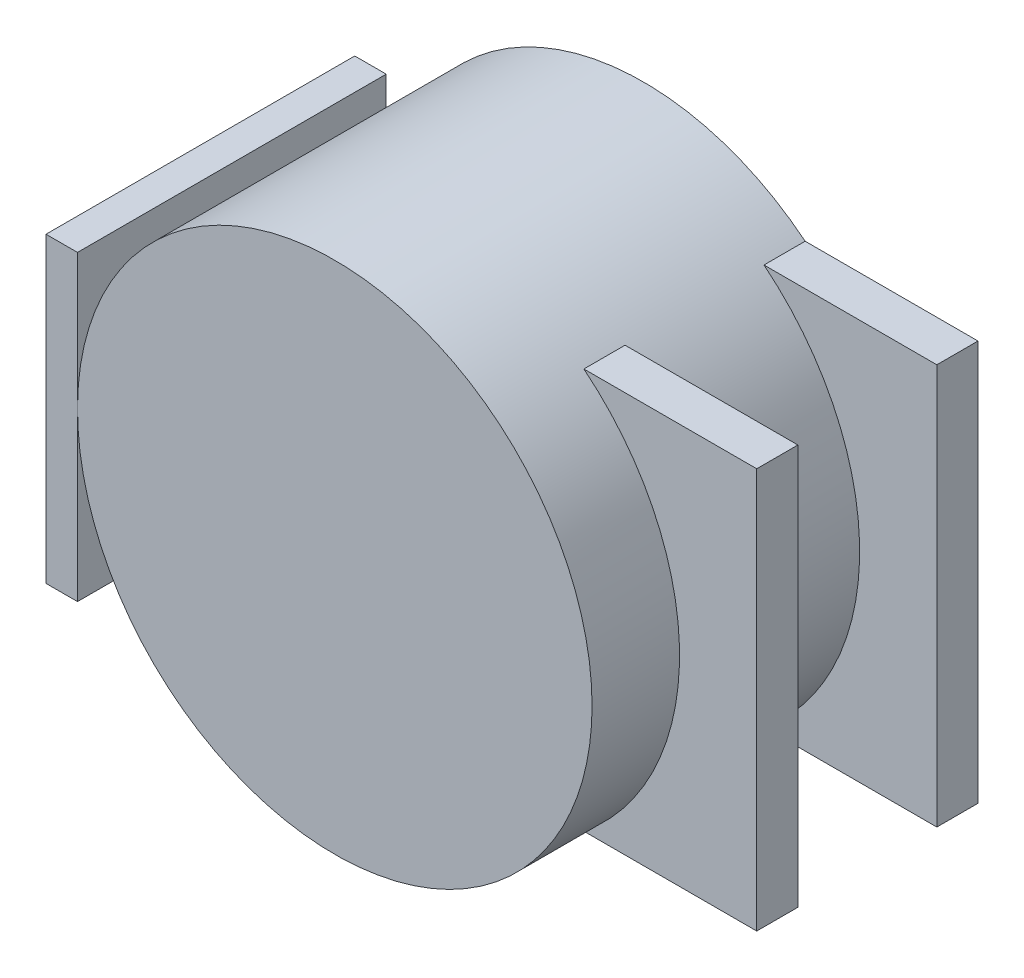
ISO-10303-21;
HEADER;
FILE_DESCRIPTION(('STEP AP214'),'2;1');
FILE_NAME('part.step','',(''),(''),'','','');
FILE_SCHEMA(('AUTOMOTIVE_DESIGN { 1 0 10303 214 1 1 1 1 }'));
ENDSEC;
DATA;
#1=APPLICATION_CONTEXT('core data for automotive mechanical design processes');
#2=APPLICATION_PROTOCOL_DEFINITION('international standard','automotive_design',2000,#1);
#3=PRODUCT_CONTEXT('',#1,'mechanical');
#4=PRODUCT('Part','Part','',(#3));
#5=PRODUCT_RELATED_PRODUCT_CATEGORY('part','',(#4));
#6=PRODUCT_DEFINITION_FORMATION('','',#4);
#7=PRODUCT_DEFINITION_CONTEXT('part definition',#1,'design');
#8=PRODUCT_DEFINITION('design','',#6,#7);
#9=PRODUCT_DEFINITION_SHAPE('','',#8);
#10=(LENGTH_UNIT() NAMED_UNIT(*) SI_UNIT(.MILLI.,.METRE.));
#11=(NAMED_UNIT(*) PLANE_ANGLE_UNIT() SI_UNIT($,.RADIAN.));
#12=(NAMED_UNIT(*) SI_UNIT($,.STERADIAN.) SOLID_ANGLE_UNIT());
#13=UNCERTAINTY_MEASURE_WITH_UNIT(LENGTH_MEASURE(1.E-05),#10,'distance_accuracy_value','');
#14=(GEOMETRIC_REPRESENTATION_CONTEXT(3) GLOBAL_UNCERTAINTY_ASSIGNED_CONTEXT((#13)) GLOBAL_UNIT_ASSIGNED_CONTEXT((#10,
#11,#12)) REPRESENTATION_CONTEXT('',''));
#15=CARTESIAN_POINT('',(0.,0.,0.));
#16=DIRECTION('',(0.,0.,1.));
#17=DIRECTION('',(1.,0.,0.));
#18=AXIS2_PLACEMENT_3D('',#15,#16,#17);
#19=CARTESIAN_POINT('',(-5.,2.63141822623568,6.));
#20=DIRECTION('',(1.,0.,0.));
#21=DIRECTION('',(0.,0.,-1.));
#22=AXIS2_PLACEMENT_3D('',#19,#20,#21);
#23=PLANE('',#22);
#24=DIRECTION('',(0.,-1.,0.));
#25=VECTOR('',#24,1.);
#26=CARTESIAN_POINT('',(-5.,2.63141822623568,0.));
#27=LINE('',#26,#25);
#28=CARTESIAN_POINT('',(-5.,2.63141822623568,0.));
#29=VERTEX_POINT('',#28);
#30=CARTESIAN_POINT('',(-5.,-3.24564847533043,0.));
#31=VERTEX_POINT('',#30);
#32=EDGE_CURVE('E115',#29,#31,#27,.T.);
#33=ORIENTED_EDGE('',*,*,#32,.F.);
#34=DIRECTION('',(0.,0.,-1.));
#35=VECTOR('',#34,1.);
#36=CARTESIAN_POINT('',(-5.,2.63141822623568,6.));
#37=LINE('',#36,#35);
#38=CARTESIAN_POINT('',(-5.,2.63141822623568,6.));
#39=VERTEX_POINT('',#38);
#40=EDGE_CURVE('E12',#39,#29,#37,.T.);
#41=ORIENTED_EDGE('',*,*,#40,.F.);
#42=DIRECTION('',(0.,-1.,0.));
#43=VECTOR('',#42,1.);
#44=CARTESIAN_POINT('',(-5.,2.63141822623568,6.));
#45=LINE('',#44,#43);
#46=CARTESIAN_POINT('',(-5.,-3.24564847533043,6.));
#47=VERTEX_POINT('',#46);
#48=EDGE_CURVE('E109',#39,#47,#45,.T.);
#49=ORIENTED_EDGE('',*,*,#48,.T.);
#50=DIRECTION('',(0.,0.,-1.));
#51=VECTOR('',#50,1.);
#52=CARTESIAN_POINT('',(-5.,-3.24564847533043,6.));
#53=LINE('',#52,#51);
#54=EDGE_CURVE('E54',#47,#31,#53,.T.);
#55=ORIENTED_EDGE('',*,*,#54,.T.);
#56=EDGE_LOOP('',(#33,#41,#49,#55));
#57=FACE_BOUND('',#56,.T.);
#58=ADVANCED_FACE('F51',(#57),#23,.T.);
#59=CARTESIAN_POINT('',(-5.,2.63141822623568,6.));
#60=DIRECTION('',(0.,1.,0.));
#61=DIRECTION('',(0.,0.,1.));
#62=AXIS2_PLACEMENT_3D('',#59,#60,#61);
#63=PLANE('',#62);
#64=DIRECTION('',(1.,0.,0.));
#65=VECTOR('',#64,1.);
#66=CARTESIAN_POINT('',(-5.,2.63141822623568,0.));
#67=LINE('',#66,#65);
#68=CARTESIAN_POINT('',(-5.61183091218427,2.63141822623568,0.));
#69=VERTEX_POINT('',#68);
#70=EDGE_CURVE('E111',#69,#29,#67,.T.);
#71=ORIENTED_EDGE('',*,*,#70,.F.);
#72=DIRECTION('',(0.,0.,-1.));
#73=VECTOR('',#72,1.);
#74=CARTESIAN_POINT('',(-5.61183091218427,2.63141822623568,6.));
#75=LINE('',#74,#73);
#76=CARTESIAN_POINT('',(-5.61183091218427,2.63141822623568,6.));
#77=VERTEX_POINT('',#76);
#78=EDGE_CURVE('E60',#77,#69,#75,.T.);
#79=ORIENTED_EDGE('',*,*,#78,.F.);
#80=DIRECTION('',(1.,0.,0.));
#81=VECTOR('',#80,1.);
#82=CARTESIAN_POINT('',(-5.,2.63141822623568,6.));
#83=LINE('',#82,#81);
#84=EDGE_CURVE('E106',#77,#39,#83,.T.);
#85=ORIENTED_EDGE('',*,*,#84,.T.);
#86=ORIENTED_EDGE('',*,*,#40,.T.);
#87=EDGE_LOOP('',(#71,#79,#85,#86));
#88=FACE_BOUND('',#87,.T.);
#89=ADVANCED_FACE('F125',(#88),#63,.T.);
#90=CARTESIAN_POINT('',(-5.61183091218427,2.63141822623568,6.));
#91=DIRECTION('',(-1.,0.,0.));
#92=DIRECTION('',(0.,0.,1.));
#93=AXIS2_PLACEMENT_3D('',#90,#91,#92);
#94=PLANE('',#93);
#95=DIRECTION('',(0.,1.,0.));
#96=VECTOR('',#95,1.);
#97=CARTESIAN_POINT('',(-5.61183091218427,2.63141822623568,0.));
#98=LINE('',#97,#96);
#99=CARTESIAN_POINT('',(-5.61183091218427,-3.24564847533043,0.));
#100=VERTEX_POINT('',#99);
#101=EDGE_CURVE('E101',#100,#69,#98,.T.);
#102=ORIENTED_EDGE('',*,*,#101,.F.);
#103=DIRECTION('',(0.,0.,-1.));
#104=VECTOR('',#103,1.);
#105=CARTESIAN_POINT('',(-5.61183091218427,-3.24564847533043,6.));
#106=LINE('',#105,#104);
#107=CARTESIAN_POINT('',(-5.61183091218427,-3.24564847533043,6.));
#108=VERTEX_POINT('',#107);
#109=EDGE_CURVE('E96',#108,#100,#106,.T.);
#110=ORIENTED_EDGE('',*,*,#109,.F.);
#111=DIRECTION('',(0.,1.,0.));
#112=VECTOR('',#111,1.);
#113=CARTESIAN_POINT('',(-5.61183091218427,2.63141822623568,6.));
#114=LINE('',#113,#112);
#115=EDGE_CURVE('E99',#108,#77,#114,.T.);
#116=ORIENTED_EDGE('',*,*,#115,.T.);
#117=ORIENTED_EDGE('',*,*,#78,.T.);
#118=EDGE_LOOP('',(#102,#110,#116,#117));
#119=FACE_BOUND('',#118,.T.);
#120=ADVANCED_FACE('F98',(#119),#94,.T.);
#121=CARTESIAN_POINT('',(-5.,-3.24564847533043,6.));
#122=DIRECTION('',(0.,-1.,0.));
#123=DIRECTION('',(0.,0.,-1.));
#124=AXIS2_PLACEMENT_3D('',#121,#122,#123);
#125=PLANE('',#124);
#126=DIRECTION('',(-1.,0.,0.));
#127=VECTOR('',#126,1.);
#128=CARTESIAN_POINT('',(-5.,-3.24564847533043,0.));
#129=LINE('',#128,#127);
#130=EDGE_CURVE('E118',#31,#100,#129,.T.);
#131=ORIENTED_EDGE('',*,*,#130,.F.);
#132=ORIENTED_EDGE('',*,*,#54,.F.);
#133=DIRECTION('',(-1.,0.,0.));
#134=VECTOR('',#133,1.);
#135=CARTESIAN_POINT('',(-5.,-3.24564847533043,6.));
#136=LINE('',#135,#134);
#137=EDGE_CURVE('E105',#47,#108,#136,.T.);
#138=ORIENTED_EDGE('',*,*,#137,.T.);
#139=ORIENTED_EDGE('',*,*,#109,.T.);
#140=EDGE_LOOP('',(#131,#132,#138,#139));
#141=FACE_BOUND('',#140,.T.);
#142=ADVANCED_FACE('F108',(#141),#125,.T.);
#143=CARTESIAN_POINT('',(0.,0.,6.));
#144=DIRECTION('',(0.,0.,-1.));
#145=DIRECTION('',(-1.,0.,0.));
#146=AXIS2_PLACEMENT_3D('',#143,#144,#145);
#147=PLANE('',#146);
#148=ORIENTED_EDGE('',*,*,#48,.F.);
#149=ORIENTED_EDGE('',*,*,#84,.F.);
#150=ORIENTED_EDGE('',*,*,#115,.F.);
#151=ORIENTED_EDGE('',*,*,#137,.F.);
#152=EDGE_LOOP('',(#148,#149,#150,#151));
#153=FACE_BOUND('',#152,.T.);
#154=ADVANCED_FACE('F104',(#153),#147,.F.);
#155=CARTESIAN_POINT('',(0.,0.,0.));
#156=DIRECTION('',(0.,0.,-1.));
#157=DIRECTION('',(-1.,0.,0.));
#158=AXIS2_PLACEMENT_3D('',#155,#156,#157);
#159=PLANE('',#158);
#160=ORIENTED_EDGE('',*,*,#32,.T.);
#161=ORIENTED_EDGE('',*,*,#130,.T.);
#162=ORIENTED_EDGE('',*,*,#101,.T.);
#163=ORIENTED_EDGE('',*,*,#70,.T.);
#164=EDGE_LOOP('',(#160,#161,#162,#163));
#165=FACE_BOUND('',#164,.T.);
#166=ADVANCED_FACE('F124',(#165),#159,.T.);
#167=CLOSED_SHELL('',(#58,#89,#120,#142,#154,#166));
#168=MANIFOLD_SOLID_BREP('B2_NOT_SHOWN',#167);
#169=CARTESIAN_POINT('',(0.,0.,6.));
#170=DIRECTION('',(0.,0.,-1.));
#171=DIRECTION('',(-1.,0.,0.));
#172=AXIS2_PLACEMENT_3D('',#169,#170,#171);
#173=CYLINDRICAL_SURFACE('',#172,5.);
#174=DIRECTION('',(0.,0.,-1.));
#175=VECTOR('',#174,1.);
#176=CARTESIAN_POINT('',(3.14107664536054,3.89019761811281,6.));
#177=LINE('',#176,#175);
#178=CARTESIAN_POINT('',(3.14107664536053,3.89019761811281,0.));
#179=VERTEX_POINT('',#178);
#180=CARTESIAN_POINT('',(3.14107664536053,3.89019761811281,0.800000000000001));
#181=VERTEX_POINT('',#180);
#182=EDGE_CURVE('E297',#179,#181,#177,.F.);
#183=ORIENTED_EDGE('',*,*,#182,.F.);
#184=CARTESIAN_POINT('',(0.,0.,0.));
#185=DIRECTION('',(0.,0.,1.));
#186=DIRECTION('',(1.,0.,0.));
#187=AXIS2_PLACEMENT_3D('',#184,#185,#186);
#188=CIRCLE('',#187,5.);
#189=CARTESIAN_POINT('',(3.14107664536053,-3.89019761811281,0.));
#190=VERTEX_POINT('',#189);
#191=EDGE_CURVE('E300',#179,#190,#188,.T.);
#192=ORIENTED_EDGE('',*,*,#191,.T.);
#193=DIRECTION('',(0.,0.,-1.));
#194=VECTOR('',#193,1.);
#195=CARTESIAN_POINT('',(3.14107664536053,-3.89019761811281,6.));
#196=LINE('',#195,#194);
#197=CARTESIAN_POINT('',(3.14107664536053,-3.89019761811281,0.8));
#198=VERTEX_POINT('',#197);
#199=EDGE_CURVE('E294',#198,#190,#196,.T.);
#200=ORIENTED_EDGE('',*,*,#199,.F.);
#201=CARTESIAN_POINT('',(0.,0.,0.8));
#202=DIRECTION('',(0.,0.,-1.));
#203=DIRECTION('',(0.,1.,0.));
#204=AXIS2_PLACEMENT_3D('',#201,#202,#203);
#205=CIRCLE('',#204,5.);
#206=EDGE_CURVE('E304',#181,#198,#205,.T.);
#207=ORIENTED_EDGE('',*,*,#206,.F.);
#208=EDGE_LOOP('',(#183,#192,#200,#207));
#209=FACE_BOUND('',#208,.T.);
#210=CARTESIAN_POINT('',(0.,0.,6.));
#211=DIRECTION('',(0.,0.,1.));
#212=DIRECTION('',(1.,0.,0.));
#213=AXIS2_PLACEMENT_3D('',#210,#211,#212);
#214=CIRCLE('',#213,5.);
#215=CARTESIAN_POINT('',(5.,0.,6.));
#216=VERTEX_POINT('',#215);
#217=EDGE_CURVE('E301',#216,#216,#214,.T.);
#218=ORIENTED_EDGE('',*,*,#217,.F.);
#219=EDGE_LOOP('',(#218));
#220=FACE_BOUND('',#219,.T.);
#221=CARTESIAN_POINT('',(0.,0.,3.5));
#222=DIRECTION('',(0.,0.,1.));
#223=DIRECTION('',(1.,0.,0.));
#224=AXIS2_PLACEMENT_3D('',#221,#222,#223);
#225=CIRCLE('',#224,5.);
#226=CARTESIAN_POINT('',(3.14107664536053,-3.89019761811282,3.5));
#227=VERTEX_POINT('',#226);
#228=CARTESIAN_POINT('',(3.14107664536054,3.89019761811281,3.5));
#229=VERTEX_POINT('',#228);
#230=EDGE_CURVE('E49',#227,#229,#225,.T.);
#231=ORIENTED_EDGE('',*,*,#230,.F.);
#232=DIRECTION('',(0.,0.,-1.));
#233=VECTOR('',#232,1.);
#234=CARTESIAN_POINT('',(3.14107664536053,-3.89019761811281,6.));
#235=LINE('',#234,#233);
#236=CARTESIAN_POINT('',(3.14107664536053,-3.89019761811281,4.3));
#237=VERTEX_POINT('',#236);
#238=EDGE_CURVE('E308',#237,#227,#235,.T.);
#239=ORIENTED_EDGE('',*,*,#238,.F.);
#240=CARTESIAN_POINT('',(0.,0.,4.3));
#241=DIRECTION('',(0.,0.,-1.));
#242=DIRECTION('',(0.,1.,0.));
#243=AXIS2_PLACEMENT_3D('',#240,#241,#242);
#244=CIRCLE('',#243,5.);
#245=CARTESIAN_POINT('',(3.14107664536053,3.89019761811281,4.3));
#246=VERTEX_POINT('',#245);
#247=EDGE_CURVE('E204',#246,#237,#244,.T.);
#248=ORIENTED_EDGE('',*,*,#247,.F.);
#249=DIRECTION('',(0.,0.,-1.));
#250=VECTOR('',#249,1.);
#251=CARTESIAN_POINT('',(3.14107664536054,3.89019761811281,6.));
#252=LINE('',#251,#250);
#253=EDGE_CURVE('E194',#229,#246,#252,.F.);
#254=ORIENTED_EDGE('',*,*,#253,.F.);
#255=EDGE_LOOP('',(#231,#239,#248,#254));
#256=FACE_BOUND('',#255,.T.);
#257=ADVANCED_FACE('F187',(#209,#220,#256),#173,.T.);
#258=CARTESIAN_POINT('',(0.,0.,6.));
#259=DIRECTION('',(0.,0.,1.));
#260=DIRECTION('',(1.,0.,0.));
#261=AXIS2_PLACEMENT_3D('',#258,#259,#260);
#262=PLANE('',#261);
#263=ORIENTED_EDGE('',*,*,#217,.T.);
#264=EDGE_LOOP('',(#263));
#265=FACE_BOUND('',#264,.T.);
#266=ADVANCED_FACE('F322',(#265),#262,.T.);
#267=CARTESIAN_POINT('',(0.,0.,0.));
#268=DIRECTION('',(0.,0.,1.));
#269=DIRECTION('',(1.,0.,0.));
#270=AXIS2_PLACEMENT_3D('',#267,#268,#269);
#271=PLANE('',#270);
#272=ORIENTED_EDGE('',*,*,#191,.F.);
#273=DIRECTION('',(-1.,0.,0.));
#274=VECTOR('',#273,1.);
#275=CARTESIAN_POINT('',(6.5,3.89019761811281,0.));
#276=LINE('',#275,#274);
#277=CARTESIAN_POINT('',(6.5,3.89019761811281,0.));
#278=VERTEX_POINT('',#277);
#279=EDGE_CURVE('E291',#278,#179,#276,.T.);
#280=ORIENTED_EDGE('',*,*,#279,.F.);
#281=DIRECTION('',(0.,1.,0.));
#282=VECTOR('',#281,1.);
#283=CARTESIAN_POINT('',(6.5,3.89019761811281,0.));
#284=LINE('',#283,#282);
#285=CARTESIAN_POINT('',(6.5,-3.89019761811281,0.));
#286=VERTEX_POINT('',#285);
#287=EDGE_CURVE('E268',#286,#278,#284,.T.);
#288=ORIENTED_EDGE('',*,*,#287,.F.);
#289=DIRECTION('',(-1.,0.,0.));
#290=VECTOR('',#289,1.);
#291=CARTESIAN_POINT('',(6.5,-3.89019761811281,0.));
#292=LINE('',#291,#290);
#293=EDGE_CURVE('E282',#286,#190,#292,.T.);
#294=ORIENTED_EDGE('',*,*,#293,.T.);
#295=EDGE_LOOP('',(#272,#280,#288,#294));
#296=FACE_BOUND('',#295,.T.);
#297=ADVANCED_FACE('F327',(#296),#271,.F.);
#298=CARTESIAN_POINT('',(6.5,3.89019761811281,0.));
#299=DIRECTION('',(0.,-1.,0.));
#300=DIRECTION('',(0.,0.,-1.));
#301=AXIS2_PLACEMENT_3D('',#298,#299,#300);
#302=PLANE('',#301);
#303=ORIENTED_EDGE('',*,*,#279,.T.);
#304=ORIENTED_EDGE('',*,*,#182,.T.);
#305=DIRECTION('',(-1.,0.,0.));
#306=VECTOR('',#305,1.);
#307=CARTESIAN_POINT('',(6.5,3.89019761811281,0.8));
#308=LINE('',#307,#306);
#309=CARTESIAN_POINT('',(6.5,3.89019761811281,0.8));
#310=VERTEX_POINT('',#309);
#311=EDGE_CURVE('E288',#310,#181,#308,.T.);
#312=ORIENTED_EDGE('',*,*,#311,.F.);
#313=DIRECTION('',(0.,0.,1.));
#314=VECTOR('',#313,1.);
#315=CARTESIAN_POINT('',(6.5,3.89019761811281,0.));
#316=LINE('',#315,#314);
#317=EDGE_CURVE('E271',#278,#310,#316,.T.);
#318=ORIENTED_EDGE('',*,*,#317,.F.);
#319=EDGE_LOOP('',(#303,#304,#312,#318));
#320=FACE_BOUND('',#319,.T.);
#321=ADVANCED_FACE('F339',(#320),#302,.F.);
#322=CARTESIAN_POINT('',(6.5,-3.89019761811281,0.));
#323=DIRECTION('',(0.,1.,0.));
#324=DIRECTION('',(0.,0.,1.));
#325=AXIS2_PLACEMENT_3D('',#322,#323,#324);
#326=PLANE('',#325);
#327=DIRECTION('',(-1.,0.,0.));
#328=VECTOR('',#327,1.);
#329=CARTESIAN_POINT('',(6.5,-3.89019761811281,0.8));
#330=LINE('',#329,#328);
#331=CARTESIAN_POINT('',(6.5,-3.89019761811281,0.8));
#332=VERTEX_POINT('',#331);
#333=EDGE_CURVE('E285',#332,#198,#330,.T.);
#334=ORIENTED_EDGE('',*,*,#333,.T.);
#335=ORIENTED_EDGE('',*,*,#199,.T.);
#336=ORIENTED_EDGE('',*,*,#293,.F.);
#337=DIRECTION('',(0.,0.,-1.));
#338=VECTOR('',#337,1.);
#339=CARTESIAN_POINT('',(6.5,-3.89019761811281,0.));
#340=LINE('',#339,#338);
#341=EDGE_CURVE('E280',#332,#286,#340,.T.);
#342=ORIENTED_EDGE('',*,*,#341,.F.);
#343=EDGE_LOOP('',(#334,#335,#336,#342));
#344=FACE_BOUND('',#343,.T.);
#345=ADVANCED_FACE('F346',(#344),#326,.F.);
#346=CARTESIAN_POINT('',(6.5,3.89019761811281,0.8));
#347=DIRECTION('',(0.,0.,-1.));
#348=DIRECTION('',(0.,1.,0.));
#349=AXIS2_PLACEMENT_3D('',#346,#347,#348);
#350=PLANE('',#349);
#351=ORIENTED_EDGE('',*,*,#311,.T.);
#352=ORIENTED_EDGE('',*,*,#206,.T.);
#353=ORIENTED_EDGE('',*,*,#333,.F.);
#354=DIRECTION('',(0.,-1.,0.));
#355=VECTOR('',#354,1.);
#356=CARTESIAN_POINT('',(6.5,3.89019761811281,0.8));
#357=LINE('',#356,#355);
#358=EDGE_CURVE('E278',#310,#332,#357,.T.);
#359=ORIENTED_EDGE('',*,*,#358,.F.);
#360=EDGE_LOOP('',(#351,#352,#353,#359));
#361=FACE_BOUND('',#360,.T.);
#362=ADVANCED_FACE('F348',(#361),#350,.F.);
#363=CARTESIAN_POINT('',(6.5,0.,0.));
#364=DIRECTION('',(-1.,0.,0.));
#365=DIRECTION('',(0.,0.,1.));
#366=AXIS2_PLACEMENT_3D('',#363,#364,#365);
#367=PLANE('',#366);
#368=ORIENTED_EDGE('',*,*,#287,.T.);
#369=ORIENTED_EDGE('',*,*,#317,.T.);
#370=ORIENTED_EDGE('',*,*,#358,.T.);
#371=ORIENTED_EDGE('',*,*,#341,.T.);
#372=EDGE_LOOP('',(#368,#369,#370,#371));
#373=FACE_BOUND('',#372,.T.);
#374=ADVANCED_FACE('F342',(#373),#367,.F.);
#375=CARTESIAN_POINT('',(6.5,3.89019761811281,3.5));
#376=DIRECTION('',(0.,-1.,0.));
#377=DIRECTION('',(0.,0.,-1.));
#378=AXIS2_PLACEMENT_3D('',#375,#376,#377);
#379=PLANE('',#378);
#380=DIRECTION('',(-1.,0.,0.));
#381=VECTOR('',#380,1.);
#382=CARTESIAN_POINT('',(6.5,3.89019761811281,3.5));
#383=LINE('',#382,#381);
#384=CARTESIAN_POINT('',(6.5,3.89019761811281,3.5));
#385=VERTEX_POINT('',#384);
#386=EDGE_CURVE('E251',#385,#229,#383,.T.);
#387=ORIENTED_EDGE('',*,*,#386,.T.);
#388=ORIENTED_EDGE('',*,*,#253,.T.);
#389=DIRECTION('',(-1.,0.,0.));
#390=VECTOR('',#389,1.);
#391=CARTESIAN_POINT('',(6.5,3.89019761811281,4.3));
#392=LINE('',#391,#390);
#393=CARTESIAN_POINT('',(6.5,3.89019761811281,4.3));
#394=VERTEX_POINT('',#393);
#395=EDGE_CURVE('E253',#394,#246,#392,.T.);
#396=ORIENTED_EDGE('',*,*,#395,.F.);
#397=DIRECTION('',(0.,0.,1.));
#398=VECTOR('',#397,1.);
#399=CARTESIAN_POINT('',(6.5,3.89019761811281,3.5));
#400=LINE('',#399,#398);
#401=EDGE_CURVE('E247',#385,#394,#400,.T.);
#402=ORIENTED_EDGE('',*,*,#401,.F.);
#403=EDGE_LOOP('',(#387,#388,#396,#402));
#404=FACE_BOUND('',#403,.T.);
#405=ADVANCED_FACE('F249',(#404),#379,.F.);
#406=CARTESIAN_POINT('',(6.5,-3.89019761811282,3.5));
#407=DIRECTION('',(0.,1.,0.));
#408=DIRECTION('',(0.,0.,1.));
#409=AXIS2_PLACEMENT_3D('',#406,#407,#408);
#410=PLANE('',#409);
#411=DIRECTION('',(-1.,0.,0.));
#412=VECTOR('',#411,1.);
#413=CARTESIAN_POINT('',(6.5,-3.89019761811282,4.3));
#414=LINE('',#413,#412);
#415=CARTESIAN_POINT('',(6.5,-3.89019761811282,4.3));
#416=VERTEX_POINT('',#415);
#417=EDGE_CURVE('E273',#416,#237,#414,.T.);
#418=ORIENTED_EDGE('',*,*,#417,.T.);
#419=ORIENTED_EDGE('',*,*,#238,.T.);
#420=DIRECTION('',(-1.,0.,0.));
#421=VECTOR('',#420,1.);
#422=CARTESIAN_POINT('',(6.5,-3.89019761811282,3.5));
#423=LINE('',#422,#421);
#424=CARTESIAN_POINT('',(6.5,-3.89019761811282,3.5));
#425=VERTEX_POINT('',#424);
#426=EDGE_CURVE('E316',#425,#227,#423,.T.);
#427=ORIENTED_EDGE('',*,*,#426,.F.);
#428=DIRECTION('',(0.,0.,-1.));
#429=VECTOR('',#428,1.);
#430=CARTESIAN_POINT('',(6.5,-3.89019761811282,3.5));
#431=LINE('',#430,#429);
#432=EDGE_CURVE('E262',#416,#425,#431,.T.);
#433=ORIENTED_EDGE('',*,*,#432,.F.);
#434=EDGE_LOOP('',(#418,#419,#427,#433));
#435=FACE_BOUND('',#434,.T.);
#436=ADVANCED_FACE('F320',(#435),#410,.F.);
#437=CARTESIAN_POINT('',(6.5,3.89019761811281,3.5));
#438=DIRECTION('',(0.,0.,1.));
#439=DIRECTION('',(1.,0.,0.));
#440=AXIS2_PLACEMENT_3D('',#437,#438,#439);
#441=PLANE('',#440);
#442=ORIENTED_EDGE('',*,*,#426,.T.);
#443=ORIENTED_EDGE('',*,*,#230,.T.);
#444=ORIENTED_EDGE('',*,*,#386,.F.);
#445=DIRECTION('',(0.,1.,0.));
#446=VECTOR('',#445,1.);
#447=CARTESIAN_POINT('',(6.5,3.89019761811281,3.5));
#448=LINE('',#447,#446);
#449=EDGE_CURVE('E257',#425,#385,#448,.T.);
#450=ORIENTED_EDGE('',*,*,#449,.F.);
#451=EDGE_LOOP('',(#442,#443,#444,#450));
#452=FACE_BOUND('',#451,.T.);
#453=ADVANCED_FACE('F267',(#452),#441,.F.);
#454=CARTESIAN_POINT('',(6.5,3.89019761811281,4.3));
#455=DIRECTION('',(0.,0.,-1.));
#456=DIRECTION('',(0.,1.,0.));
#457=AXIS2_PLACEMENT_3D('',#454,#455,#456);
#458=PLANE('',#457);
#459=ORIENTED_EDGE('',*,*,#395,.T.);
#460=ORIENTED_EDGE('',*,*,#247,.T.);
#461=ORIENTED_EDGE('',*,*,#417,.F.);
#462=DIRECTION('',(0.,-1.,0.));
#463=VECTOR('',#462,1.);
#464=CARTESIAN_POINT('',(6.5,3.89019761811281,4.3));
#465=LINE('',#464,#463);
#466=EDGE_CURVE('E256',#394,#416,#465,.T.);
#467=ORIENTED_EDGE('',*,*,#466,.F.);
#468=EDGE_LOOP('',(#459,#460,#461,#467));
#469=FACE_BOUND('',#468,.T.);
#470=ADVANCED_FACE('F312',(#469),#458,.F.);
#471=CARTESIAN_POINT('',(6.5,0.,3.5));
#472=DIRECTION('',(-1.,0.,0.));
#473=DIRECTION('',(0.,0.,1.));
#474=AXIS2_PLACEMENT_3D('',#471,#472,#473);
#475=PLANE('',#474);
#476=ORIENTED_EDGE('',*,*,#449,.T.);
#477=ORIENTED_EDGE('',*,*,#401,.T.);
#478=ORIENTED_EDGE('',*,*,#466,.T.);
#479=ORIENTED_EDGE('',*,*,#432,.T.);
#480=EDGE_LOOP('',(#476,#477,#478,#479));
#481=FACE_BOUND('',#480,.T.);
#482=ADVANCED_FACE('F260',(#481),#475,.F.);
#483=CLOSED_SHELL('',(#257,#266,#297,#321,#345,#362,#374,#405,#436,#453,#470,#482));
#484=MANIFOLD_SOLID_BREP('B6',#483);
#485=ADVANCED_BREP_SHAPE_REPRESENTATION('',(#18,#168,#484),#14);
#486=SHAPE_DEFINITION_REPRESENTATION(#9,#485);
ENDSEC;
END-ISO-10303-21;
